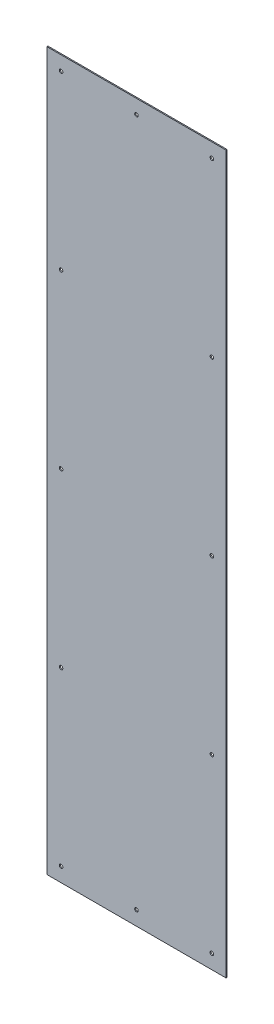
ISO-10303-21;
HEADER;
FILE_DESCRIPTION(('STEP AP214'),'2;1');
FILE_NAME('part.step','',(''),(''),'','','');
FILE_SCHEMA(('AUTOMOTIVE_DESIGN { 1 0 10303 214 1 1 1 1 }'));
ENDSEC;
DATA;
#1=APPLICATION_CONTEXT('core data for automotive mechanical design processes');
#2=APPLICATION_PROTOCOL_DEFINITION('international standard','automotive_design',2000,#1);
#3=PRODUCT_CONTEXT('',#1,'mechanical');
#4=PRODUCT('Part','Part','',(#3));
#5=PRODUCT_RELATED_PRODUCT_CATEGORY('part','',(#4));
#6=PRODUCT_DEFINITION_FORMATION('','',#4);
#7=PRODUCT_DEFINITION_CONTEXT('part definition',#1,'design');
#8=PRODUCT_DEFINITION('design','',#6,#7);
#9=PRODUCT_DEFINITION_SHAPE('','',#8);
#10=(LENGTH_UNIT() NAMED_UNIT(*) SI_UNIT(.MILLI.,.METRE.));
#11=(NAMED_UNIT(*) PLANE_ANGLE_UNIT() SI_UNIT($,.RADIAN.));
#12=(NAMED_UNIT(*) SI_UNIT($,.STERADIAN.) SOLID_ANGLE_UNIT());
#13=UNCERTAINTY_MEASURE_WITH_UNIT(LENGTH_MEASURE(1.E-05),#10,'distance_accuracy_value','');
#14=(GEOMETRIC_REPRESENTATION_CONTEXT(3) GLOBAL_UNCERTAINTY_ASSIGNED_CONTEXT((#13)) GLOBAL_UNIT_ASSIGNED_CONTEXT((#10,
#11,#12)) REPRESENTATION_CONTEXT('',''));
#15=CARTESIAN_POINT('',(0.,0.,0.));
#16=DIRECTION('',(0.,0.,1.));
#17=DIRECTION('',(1.,0.,0.));
#18=AXIS2_PLACEMENT_3D('',#15,#16,#17);
#19=CARTESIAN_POINT('',(160.,640.,1.9));
#20=DIRECTION('',(-1.,0.,0.));
#21=DIRECTION('',(0.,-1.,0.));
#22=AXIS2_PLACEMENT_3D('',#19,#20,#21);
#23=PLANE('',#22);
#24=DIRECTION('',(0.,1.,0.));
#25=VECTOR('',#24,1.);
#26=CARTESIAN_POINT('',(160.,640.,0.));
#27=LINE('',#26,#25);
#28=CARTESIAN_POINT('',(160.,-640.,0.));
#29=VERTEX_POINT('',#28);
#30=CARTESIAN_POINT('',(160.,640.,0.));
#31=VERTEX_POINT('',#30);
#32=EDGE_CURVE('E98',#29,#31,#27,.T.);
#33=ORIENTED_EDGE('',*,*,#32,.T.);
#34=DIRECTION('',(0.,0.,-1.));
#35=VECTOR('',#34,1.);
#36=CARTESIAN_POINT('',(160.,640.,1.9));
#37=LINE('',#36,#35);
#38=CARTESIAN_POINT('',(160.,640.,1.9));
#39=VERTEX_POINT('',#38);
#40=EDGE_CURVE('E11',#39,#31,#37,.T.);
#41=ORIENTED_EDGE('',*,*,#40,.F.);
#42=DIRECTION('',(0.,1.,0.));
#43=VECTOR('',#42,1.);
#44=CARTESIAN_POINT('',(160.,640.,1.9));
#45=LINE('',#44,#43);
#46=CARTESIAN_POINT('',(160.,-640.,1.9));
#47=VERTEX_POINT('',#46);
#48=EDGE_CURVE('E85',#47,#39,#45,.T.);
#49=ORIENTED_EDGE('',*,*,#48,.F.);
#50=DIRECTION('',(0.,0.,-1.));
#51=VECTOR('',#50,1.);
#52=CARTESIAN_POINT('',(160.,-640.,1.9));
#53=LINE('',#52,#51);
#54=EDGE_CURVE('E94',#47,#29,#53,.T.);
#55=ORIENTED_EDGE('',*,*,#54,.T.);
#56=EDGE_LOOP('',(#33,#41,#49,#55));
#57=FACE_BOUND('',#56,.T.);
#58=ADVANCED_FACE('F32',(#57),#23,.F.);
#59=CARTESIAN_POINT('',(-160.,640.,1.9));
#60=DIRECTION('',(0.,-1.,0.));
#61=DIRECTION('',(0.,0.,-1.));
#62=AXIS2_PLACEMENT_3D('',#59,#60,#61);
#63=PLANE('',#62);
#64=DIRECTION('',(-1.,0.,0.));
#65=VECTOR('',#64,1.);
#66=CARTESIAN_POINT('',(-160.,640.,0.));
#67=LINE('',#66,#65);
#68=CARTESIAN_POINT('',(-160.,640.,0.));
#69=VERTEX_POINT('',#68);
#70=EDGE_CURVE('E89',#31,#69,#67,.T.);
#71=ORIENTED_EDGE('',*,*,#70,.T.);
#72=DIRECTION('',(0.,0.,-1.));
#73=VECTOR('',#72,1.);
#74=CARTESIAN_POINT('',(-160.,640.,1.9));
#75=LINE('',#74,#73);
#76=CARTESIAN_POINT('',(-160.,640.,1.9));
#77=VERTEX_POINT('',#76);
#78=EDGE_CURVE('E41',#77,#69,#75,.T.);
#79=ORIENTED_EDGE('',*,*,#78,.F.);
#80=DIRECTION('',(-1.,0.,0.));
#81=VECTOR('',#80,1.);
#82=CARTESIAN_POINT('',(-160.,640.,1.9));
#83=LINE('',#82,#81);
#84=EDGE_CURVE('E80',#39,#77,#83,.T.);
#85=ORIENTED_EDGE('',*,*,#84,.F.);
#86=ORIENTED_EDGE('',*,*,#40,.T.);
#87=EDGE_LOOP('',(#71,#79,#85,#86));
#88=FACE_BOUND('',#87,.T.);
#89=ADVANCED_FACE('F88',(#88),#63,.F.);
#90=CARTESIAN_POINT('',(-160.,640.,1.9));
#91=DIRECTION('',(1.,0.,0.));
#92=DIRECTION('',(0.,1.,0.));
#93=AXIS2_PLACEMENT_3D('',#90,#91,#92);
#94=PLANE('',#93);
#95=DIRECTION('',(0.,-1.,0.));
#96=VECTOR('',#95,1.);
#97=CARTESIAN_POINT('',(-160.,640.,0.));
#98=LINE('',#97,#96);
#99=CARTESIAN_POINT('',(-160.,-640.,0.));
#100=VERTEX_POINT('',#99);
#101=EDGE_CURVE('E67',#69,#100,#98,.T.);
#102=ORIENTED_EDGE('',*,*,#101,.T.);
#103=DIRECTION('',(0.,0.,-1.));
#104=VECTOR('',#103,1.);
#105=CARTESIAN_POINT('',(-160.,-640.,1.9));
#106=LINE('',#105,#104);
#107=CARTESIAN_POINT('',(-160.,-640.,1.9));
#108=VERTEX_POINT('',#107);
#109=EDGE_CURVE('E90',#108,#100,#106,.T.);
#110=ORIENTED_EDGE('',*,*,#109,.F.);
#111=DIRECTION('',(0.,-1.,0.));
#112=VECTOR('',#111,1.);
#113=CARTESIAN_POINT('',(-160.,640.,1.9));
#114=LINE('',#113,#112);
#115=EDGE_CURVE('E83',#77,#108,#114,.T.);
#116=ORIENTED_EDGE('',*,*,#115,.F.);
#117=ORIENTED_EDGE('',*,*,#78,.T.);
#118=EDGE_LOOP('',(#102,#110,#116,#117));
#119=FACE_BOUND('',#118,.T.);
#120=ADVANCED_FACE('F92',(#119),#94,.F.);
#121=CARTESIAN_POINT('',(-160.,-640.,1.9));
#122=DIRECTION('',(0.,1.,0.));
#123=DIRECTION('',(0.,0.,1.));
#124=AXIS2_PLACEMENT_3D('',#121,#122,#123);
#125=PLANE('',#124);
#126=DIRECTION('',(1.,0.,0.));
#127=VECTOR('',#126,1.);
#128=CARTESIAN_POINT('',(-160.,-640.,0.));
#129=LINE('',#128,#127);
#130=EDGE_CURVE('E73',#100,#29,#129,.T.);
#131=ORIENTED_EDGE('',*,*,#130,.T.);
#132=ORIENTED_EDGE('',*,*,#54,.F.);
#133=DIRECTION('',(1.,0.,0.));
#134=VECTOR('',#133,1.);
#135=CARTESIAN_POINT('',(-160.,-640.,1.9));
#136=LINE('',#135,#134);
#137=EDGE_CURVE('E50',#108,#47,#136,.T.);
#138=ORIENTED_EDGE('',*,*,#137,.F.);
#139=ORIENTED_EDGE('',*,*,#109,.T.);
#140=EDGE_LOOP('',(#131,#132,#138,#139));
#141=FACE_BOUND('',#140,.T.);
#142=ADVANCED_FACE('F188',(#141),#125,.F.);
#143=CARTESIAN_POINT('',(0.,0.,1.9));
#144=DIRECTION('',(0.,0.,1.));
#145=DIRECTION('',(1.,0.,0.));
#146=AXIS2_PLACEMENT_3D('',#143,#144,#145);
#147=PLANE('',#146);
#148=CARTESIAN_POINT('',(-134.6,-307.3,1.9));
#149=DIRECTION('',(0.,0.,1.));
#150=DIRECTION('',(1.,0.,0.));
#151=AXIS2_PLACEMENT_3D('',#148,#149,#150);
#152=CIRCLE('',#151,3.175);
#153=CARTESIAN_POINT('',(-131.425,-307.3,1.9));
#154=VERTEX_POINT('',#153);
#155=EDGE_CURVE('E167',#154,#154,#152,.T.);
#156=ORIENTED_EDGE('',*,*,#155,.F.);
#157=EDGE_LOOP('',(#156));
#158=FACE_BOUND('',#157,.T.);
#159=CARTESIAN_POINT('',(134.6,0.,1.9));
#160=DIRECTION('',(0.,0.,1.));
#161=DIRECTION('',(1.,0.,0.));
#162=AXIS2_PLACEMENT_3D('',#159,#160,#161);
#163=CIRCLE('',#162,3.175);
#164=CARTESIAN_POINT('',(137.775,0.,1.9));
#165=VERTEX_POINT('',#164);
#166=EDGE_CURVE('E166',#165,#165,#163,.T.);
#167=ORIENTED_EDGE('',*,*,#166,.F.);
#168=EDGE_LOOP('',(#167));
#169=FACE_BOUND('',#168,.T.);
#170=CARTESIAN_POINT('',(-134.6,0.,1.9));
#171=DIRECTION('',(0.,0.,1.));
#172=DIRECTION('',(1.,0.,0.));
#173=AXIS2_PLACEMENT_3D('',#170,#171,#172);
#174=CIRCLE('',#173,3.175);
#175=CARTESIAN_POINT('',(-131.425,0.,1.9));
#176=VERTEX_POINT('',#175);
#177=EDGE_CURVE('E153',#176,#176,#174,.T.);
#178=ORIENTED_EDGE('',*,*,#177,.F.);
#179=EDGE_LOOP('',(#178));
#180=FACE_BOUND('',#179,.T.);
#181=CARTESIAN_POINT('',(134.6,-307.3,1.9));
#182=DIRECTION('',(0.,0.,1.));
#183=DIRECTION('',(1.,0.,0.));
#184=AXIS2_PLACEMENT_3D('',#181,#182,#183);
#185=CIRCLE('',#184,3.175);
#186=CARTESIAN_POINT('',(137.775,-307.3,1.9));
#187=VERTEX_POINT('',#186);
#188=EDGE_CURVE('E170',#187,#187,#185,.T.);
#189=ORIENTED_EDGE('',*,*,#188,.F.);
#190=EDGE_LOOP('',(#189));
#191=FACE_BOUND('',#190,.T.);
#192=CARTESIAN_POINT('',(-134.6,307.3,1.9));
#193=DIRECTION('',(0.,0.,1.));
#194=DIRECTION('',(-1.,0.,0.));
#195=AXIS2_PLACEMENT_3D('',#192,#193,#194);
#196=CIRCLE('',#195,3.175);
#197=CARTESIAN_POINT('',(-137.775,307.3,1.9));
#198=VERTEX_POINT('',#197);
#199=EDGE_CURVE('E176',#198,#198,#196,.T.);
#200=ORIENTED_EDGE('',*,*,#199,.F.);
#201=EDGE_LOOP('',(#200));
#202=FACE_BOUND('',#201,.T.);
#203=CARTESIAN_POINT('',(134.6,307.3,1.9));
#204=DIRECTION('',(0.,0.,1.));
#205=DIRECTION('',(-1.,0.,0.));
#206=AXIS2_PLACEMENT_3D('',#203,#204,#205);
#207=CIRCLE('',#206,3.175);
#208=CARTESIAN_POINT('',(131.425,307.3,1.9));
#209=VERTEX_POINT('',#208);
#210=EDGE_CURVE('E173',#209,#209,#207,.T.);
#211=ORIENTED_EDGE('',*,*,#210,.F.);
#212=EDGE_LOOP('',(#211));
#213=FACE_BOUND('',#212,.T.);
#214=CARTESIAN_POINT('',(0.,614.6,1.9));
#215=DIRECTION('',(0.,0.,1.));
#216=DIRECTION('',(1.,0.,0.));
#217=AXIS2_PLACEMENT_3D('',#214,#215,#216);
#218=CIRCLE('',#217,3.175);
#219=CARTESIAN_POINT('',(3.17499999999997,614.6,1.9));
#220=VERTEX_POINT('',#219);
#221=EDGE_CURVE('E149',#220,#220,#218,.T.);
#222=ORIENTED_EDGE('',*,*,#221,.F.);
#223=EDGE_LOOP('',(#222));
#224=FACE_BOUND('',#223,.T.);
#225=CARTESIAN_POINT('',(0.,-614.6,1.9));
#226=DIRECTION('',(0.,0.,1.));
#227=DIRECTION('',(-1.,0.,0.));
#228=AXIS2_PLACEMENT_3D('',#225,#226,#227);
#229=CIRCLE('',#228,3.175);
#230=CARTESIAN_POINT('',(-3.17500000000003,-614.6,1.9));
#231=VERTEX_POINT('',#230);
#232=EDGE_CURVE('E152',#231,#231,#229,.T.);
#233=ORIENTED_EDGE('',*,*,#232,.F.);
#234=EDGE_LOOP('',(#233));
#235=FACE_BOUND('',#234,.T.);
#236=CARTESIAN_POINT('',(-134.6,-614.6,1.9));
#237=DIRECTION('',(0.,0.,1.));
#238=DIRECTION('',(-1.,0.,0.));
#239=AXIS2_PLACEMENT_3D('',#236,#237,#238);
#240=CIRCLE('',#239,3.175);
#241=CARTESIAN_POINT('',(-137.775,-614.6,1.9));
#242=VERTEX_POINT('',#241);
#243=EDGE_CURVE('E156',#242,#242,#240,.T.);
#244=ORIENTED_EDGE('',*,*,#243,.F.);
#245=EDGE_LOOP('',(#244));
#246=FACE_BOUND('',#245,.T.);
#247=CARTESIAN_POINT('',(134.6,-614.6,1.9));
#248=DIRECTION('',(0.,0.,1.));
#249=DIRECTION('',(1.,0.,0.));
#250=AXIS2_PLACEMENT_3D('',#247,#248,#249);
#251=CIRCLE('',#250,3.17499999999981);
#252=CARTESIAN_POINT('',(137.775,-614.6,1.9));
#253=VERTEX_POINT('',#252);
#254=EDGE_CURVE('E159',#253,#253,#251,.T.);
#255=ORIENTED_EDGE('',*,*,#254,.F.);
#256=EDGE_LOOP('',(#255));
#257=FACE_BOUND('',#256,.T.);
#258=CARTESIAN_POINT('',(134.6,614.6,1.9));
#259=DIRECTION('',(0.,0.,1.));
#260=DIRECTION('',(-1.,0.,0.));
#261=AXIS2_PLACEMENT_3D('',#258,#259,#260);
#262=CIRCLE('',#261,3.17499999999981);
#263=CARTESIAN_POINT('',(131.425,614.6,1.9));
#264=VERTEX_POINT('',#263);
#265=EDGE_CURVE('E114',#264,#264,#262,.T.);
#266=ORIENTED_EDGE('',*,*,#265,.F.);
#267=EDGE_LOOP('',(#266));
#268=FACE_BOUND('',#267,.T.);
#269=CARTESIAN_POINT('',(-134.6,614.6,1.9));
#270=DIRECTION('',(0.,0.,1.));
#271=DIRECTION('',(1.,0.,0.));
#272=AXIS2_PLACEMENT_3D('',#269,#270,#271);
#273=CIRCLE('',#272,3.175);
#274=CARTESIAN_POINT('',(-131.425,614.6,1.9));
#275=VERTEX_POINT('',#274);
#276=EDGE_CURVE('E109',#275,#275,#273,.T.);
#277=ORIENTED_EDGE('',*,*,#276,.F.);
#278=EDGE_LOOP('',(#277));
#279=FACE_BOUND('',#278,.T.);
#280=ORIENTED_EDGE('',*,*,#48,.T.);
#281=ORIENTED_EDGE('',*,*,#84,.T.);
#282=ORIENTED_EDGE('',*,*,#115,.T.);
#283=ORIENTED_EDGE('',*,*,#137,.T.);
#284=EDGE_LOOP('',(#280,#281,#282,#283));
#285=FACE_BOUND('',#284,.T.);
#286=ADVANCED_FACE('F81',(#158,#169,#180,#191,#202,#213,#224,#235,#246,#257,#268,#279,#285),
#147,.T.);
#287=CARTESIAN_POINT('',(0.,0.,0.));
#288=DIRECTION('',(0.,0.,1.));
#289=DIRECTION('',(1.,0.,0.));
#290=AXIS2_PLACEMENT_3D('',#287,#288,#289);
#291=PLANE('',#290);
#292=CARTESIAN_POINT('',(-134.6,-307.3,0.));
#293=DIRECTION('',(0.,0.,1.));
#294=DIRECTION('',(1.,0.,0.));
#295=AXIS2_PLACEMENT_3D('',#292,#293,#294);
#296=CIRCLE('',#295,3.175);
#297=CARTESIAN_POINT('',(-131.425,-307.3,0.));
#298=VERTEX_POINT('',#297);
#299=EDGE_CURVE('E35',#298,#298,#296,.T.);
#300=ORIENTED_EDGE('',*,*,#299,.T.);
#301=EDGE_LOOP('',(#300));
#302=FACE_BOUND('',#301,.T.);
#303=CARTESIAN_POINT('',(134.6,0.,0.));
#304=DIRECTION('',(0.,0.,1.));
#305=DIRECTION('',(1.,0.,0.));
#306=AXIS2_PLACEMENT_3D('',#303,#304,#305);
#307=CIRCLE('',#306,3.175);
#308=CARTESIAN_POINT('',(137.775,0.,0.));
#309=VERTEX_POINT('',#308);
#310=EDGE_CURVE('E137',#309,#309,#307,.T.);
#311=ORIENTED_EDGE('',*,*,#310,.T.);
#312=EDGE_LOOP('',(#311));
#313=FACE_BOUND('',#312,.T.);
#314=CARTESIAN_POINT('',(-134.6,0.,0.));
#315=DIRECTION('',(0.,0.,1.));
#316=DIRECTION('',(1.,0.,0.));
#317=AXIS2_PLACEMENT_3D('',#314,#315,#316);
#318=CIRCLE('',#317,3.175);
#319=CARTESIAN_POINT('',(-131.425,0.,0.));
#320=VERTEX_POINT('',#319);
#321=EDGE_CURVE('E135',#320,#320,#318,.T.);
#322=ORIENTED_EDGE('',*,*,#321,.T.);
#323=EDGE_LOOP('',(#322));
#324=FACE_BOUND('',#323,.T.);
#325=CARTESIAN_POINT('',(134.6,-307.3,0.));
#326=DIRECTION('',(0.,0.,1.));
#327=DIRECTION('',(1.,0.,0.));
#328=AXIS2_PLACEMENT_3D('',#325,#326,#327);
#329=CIRCLE('',#328,3.175);
#330=CARTESIAN_POINT('',(137.775,-307.3,0.));
#331=VERTEX_POINT('',#330);
#332=EDGE_CURVE('E132',#331,#331,#329,.T.);
#333=ORIENTED_EDGE('',*,*,#332,.T.);
#334=EDGE_LOOP('',(#333));
#335=FACE_BOUND('',#334,.T.);
#336=CARTESIAN_POINT('',(-134.6,307.3,0.));
#337=DIRECTION('',(0.,0.,1.));
#338=DIRECTION('',(1.,0.,0.));
#339=AXIS2_PLACEMENT_3D('',#336,#337,#338);
#340=CIRCLE('',#339,3.175);
#341=CARTESIAN_POINT('',(-131.425,307.3,0.));
#342=VERTEX_POINT('',#341);
#343=EDGE_CURVE('E129',#342,#342,#340,.T.);
#344=ORIENTED_EDGE('',*,*,#343,.T.);
#345=EDGE_LOOP('',(#344));
#346=FACE_BOUND('',#345,.T.);
#347=CARTESIAN_POINT('',(134.6,307.3,0.));
#348=DIRECTION('',(0.,0.,1.));
#349=DIRECTION('',(1.,0.,0.));
#350=AXIS2_PLACEMENT_3D('',#347,#348,#349);
#351=CIRCLE('',#350,3.175);
#352=CARTESIAN_POINT('',(137.775,307.3,0.));
#353=VERTEX_POINT('',#352);
#354=EDGE_CURVE('E126',#353,#353,#351,.T.);
#355=ORIENTED_EDGE('',*,*,#354,.T.);
#356=EDGE_LOOP('',(#355));
#357=FACE_BOUND('',#356,.T.);
#358=CARTESIAN_POINT('',(0.,614.6,0.));
#359=DIRECTION('',(0.,0.,1.));
#360=DIRECTION('',(1.,0.,0.));
#361=AXIS2_PLACEMENT_3D('',#358,#359,#360);
#362=CIRCLE('',#361,3.175);
#363=CARTESIAN_POINT('',(3.17499999999997,614.6,0.));
#364=VERTEX_POINT('',#363);
#365=EDGE_CURVE('E123',#364,#364,#362,.T.);
#366=ORIENTED_EDGE('',*,*,#365,.T.);
#367=EDGE_LOOP('',(#366));
#368=FACE_BOUND('',#367,.T.);
#369=CARTESIAN_POINT('',(0.,-614.6,0.));
#370=DIRECTION('',(0.,0.,1.));
#371=DIRECTION('',(1.,0.,0.));
#372=AXIS2_PLACEMENT_3D('',#369,#370,#371);
#373=CIRCLE('',#372,3.175);
#374=CARTESIAN_POINT('',(3.17499999999997,-614.6,0.));
#375=VERTEX_POINT('',#374);
#376=EDGE_CURVE('E120',#375,#375,#373,.T.);
#377=ORIENTED_EDGE('',*,*,#376,.T.);
#378=EDGE_LOOP('',(#377));
#379=FACE_BOUND('',#378,.T.);
#380=CARTESIAN_POINT('',(-134.6,-614.6,0.));
#381=DIRECTION('',(0.,0.,1.));
#382=DIRECTION('',(1.,0.,0.));
#383=AXIS2_PLACEMENT_3D('',#380,#381,#382);
#384=CIRCLE('',#383,3.175);
#385=CARTESIAN_POINT('',(-131.425,-614.6,0.));
#386=VERTEX_POINT('',#385);
#387=EDGE_CURVE('E117',#386,#386,#384,.T.);
#388=ORIENTED_EDGE('',*,*,#387,.T.);
#389=EDGE_LOOP('',(#388));
#390=FACE_BOUND('',#389,.T.);
#391=CARTESIAN_POINT('',(134.6,-614.6,0.));
#392=DIRECTION('',(0.,0.,1.));
#393=DIRECTION('',(1.,0.,0.));
#394=AXIS2_PLACEMENT_3D('',#391,#392,#393);
#395=CIRCLE('',#394,3.17499999999981);
#396=CARTESIAN_POINT('',(137.775,-614.6,0.));
#397=VERTEX_POINT('',#396);
#398=EDGE_CURVE('E113',#397,#397,#395,.T.);
#399=ORIENTED_EDGE('',*,*,#398,.T.);
#400=EDGE_LOOP('',(#399));
#401=FACE_BOUND('',#400,.T.);
#402=CARTESIAN_POINT('',(134.6,614.6,0.));
#403=DIRECTION('',(0.,0.,1.));
#404=DIRECTION('',(1.,0.,0.));
#405=AXIS2_PLACEMENT_3D('',#402,#403,#404);
#406=CIRCLE('',#405,3.17499999999981);
#407=CARTESIAN_POINT('',(137.775,614.6,0.));
#408=VERTEX_POINT('',#407);
#409=EDGE_CURVE('E110',#408,#408,#406,.T.);
#410=ORIENTED_EDGE('',*,*,#409,.T.);
#411=EDGE_LOOP('',(#410));
#412=FACE_BOUND('',#411,.T.);
#413=CARTESIAN_POINT('',(-134.6,614.6,0.));
#414=DIRECTION('',(0.,0.,1.));
#415=DIRECTION('',(1.,0.,0.));
#416=AXIS2_PLACEMENT_3D('',#413,#414,#415);
#417=CIRCLE('',#416,3.175);
#418=CARTESIAN_POINT('',(-131.425,614.6,0.));
#419=VERTEX_POINT('',#418);
#420=EDGE_CURVE('E101',#419,#419,#417,.T.);
#421=ORIENTED_EDGE('',*,*,#420,.T.);
#422=EDGE_LOOP('',(#421));
#423=FACE_BOUND('',#422,.T.);
#424=ORIENTED_EDGE('',*,*,#32,.F.);
#425=ORIENTED_EDGE('',*,*,#130,.F.);
#426=ORIENTED_EDGE('',*,*,#101,.F.);
#427=ORIENTED_EDGE('',*,*,#70,.F.);
#428=EDGE_LOOP('',(#424,#425,#426,#427));
#429=FACE_BOUND('',#428,.T.);
#430=ADVANCED_FACE('F187',(#302,#313,#324,#335,#346,#357,#368,#379,#390,#401,#412,#423,#429),
#291,.F.);
#431=CARTESIAN_POINT('',(-134.6,614.6,-8.1));
#432=DIRECTION('',(0.,0.,1.));
#433=DIRECTION('',(1.,0.,0.));
#434=AXIS2_PLACEMENT_3D('',#431,#432,#433);
#435=CYLINDRICAL_SURFACE('',#434,3.175);
#436=ORIENTED_EDGE('',*,*,#276,.T.);
#437=EDGE_LOOP('',(#436));
#438=FACE_BOUND('',#437,.T.);
#439=ORIENTED_EDGE('',*,*,#420,.F.);
#440=EDGE_LOOP('',(#439));
#441=FACE_BOUND('',#440,.T.);
#442=ADVANCED_FACE('F210',(#438,#441),#435,.F.);
#443=CARTESIAN_POINT('',(134.6,614.6,-8.1));
#444=DIRECTION('',(0.,0.,1.));
#445=DIRECTION('',(1.,0.,0.));
#446=AXIS2_PLACEMENT_3D('',#443,#444,#445);
#447=CYLINDRICAL_SURFACE('',#446,3.17499999999981);
#448=ORIENTED_EDGE('',*,*,#265,.T.);
#449=EDGE_LOOP('',(#448));
#450=FACE_BOUND('',#449,.T.);
#451=ORIENTED_EDGE('',*,*,#409,.F.);
#452=EDGE_LOOP('',(#451));
#453=FACE_BOUND('',#452,.T.);
#454=ADVANCED_FACE('F206',(#450,#453),#447,.F.);
#455=CARTESIAN_POINT('',(134.6,-614.6,-8.1));
#456=DIRECTION('',(0.,0.,1.));
#457=DIRECTION('',(1.,0.,0.));
#458=AXIS2_PLACEMENT_3D('',#455,#456,#457);
#459=CYLINDRICAL_SURFACE('',#458,3.17499999999981);
#460=ORIENTED_EDGE('',*,*,#254,.T.);
#461=EDGE_LOOP('',(#460));
#462=FACE_BOUND('',#461,.T.);
#463=ORIENTED_EDGE('',*,*,#398,.F.);
#464=EDGE_LOOP('',(#463));
#465=FACE_BOUND('',#464,.T.);
#466=ADVANCED_FACE('F209',(#462,#465),#459,.F.);
#467=CARTESIAN_POINT('',(-134.6,-614.6,-8.1));
#468=DIRECTION('',(0.,0.,1.));
#469=DIRECTION('',(1.,0.,0.));
#470=AXIS2_PLACEMENT_3D('',#467,#468,#469);
#471=CYLINDRICAL_SURFACE('',#470,3.175);
#472=ORIENTED_EDGE('',*,*,#243,.T.);
#473=EDGE_LOOP('',(#472));
#474=FACE_BOUND('',#473,.T.);
#475=ORIENTED_EDGE('',*,*,#387,.F.);
#476=EDGE_LOOP('',(#475));
#477=FACE_BOUND('',#476,.T.);
#478=ADVANCED_FACE('F276',(#474,#477),#471,.F.);
#479=CARTESIAN_POINT('',(0.,-614.6,-8.1));
#480=DIRECTION('',(0.,0.,1.));
#481=DIRECTION('',(1.,0.,0.));
#482=AXIS2_PLACEMENT_3D('',#479,#480,#481);
#483=CYLINDRICAL_SURFACE('',#482,3.175);
#484=ORIENTED_EDGE('',*,*,#232,.T.);
#485=EDGE_LOOP('',(#484));
#486=FACE_BOUND('',#485,.T.);
#487=ORIENTED_EDGE('',*,*,#376,.F.);
#488=EDGE_LOOP('',(#487));
#489=FACE_BOUND('',#488,.T.);
#490=ADVANCED_FACE('F286',(#486,#489),#483,.F.);
#491=CARTESIAN_POINT('',(0.,614.6,-8.1));
#492=DIRECTION('',(0.,0.,1.));
#493=DIRECTION('',(1.,0.,0.));
#494=AXIS2_PLACEMENT_3D('',#491,#492,#493);
#495=CYLINDRICAL_SURFACE('',#494,3.175);
#496=ORIENTED_EDGE('',*,*,#221,.T.);
#497=EDGE_LOOP('',(#496));
#498=FACE_BOUND('',#497,.T.);
#499=ORIENTED_EDGE('',*,*,#365,.F.);
#500=EDGE_LOOP('',(#499));
#501=FACE_BOUND('',#500,.T.);
#502=ADVANCED_FACE('F296',(#498,#501),#495,.F.);
#503=CARTESIAN_POINT('',(134.6,307.3,-8.1));
#504=DIRECTION('',(0.,0.,1.));
#505=DIRECTION('',(1.,0.,0.));
#506=AXIS2_PLACEMENT_3D('',#503,#504,#505);
#507=CYLINDRICAL_SURFACE('',#506,3.175);
#508=ORIENTED_EDGE('',*,*,#210,.T.);
#509=EDGE_LOOP('',(#508));
#510=FACE_BOUND('',#509,.T.);
#511=ORIENTED_EDGE('',*,*,#354,.F.);
#512=EDGE_LOOP('',(#511));
#513=FACE_BOUND('',#512,.T.);
#514=ADVANCED_FACE('F306',(#510,#513),#507,.F.);
#515=CARTESIAN_POINT('',(-134.6,307.3,-8.1));
#516=DIRECTION('',(0.,0.,1.));
#517=DIRECTION('',(1.,0.,0.));
#518=AXIS2_PLACEMENT_3D('',#515,#516,#517);
#519=CYLINDRICAL_SURFACE('',#518,3.175);
#520=ORIENTED_EDGE('',*,*,#199,.T.);
#521=EDGE_LOOP('',(#520));
#522=FACE_BOUND('',#521,.T.);
#523=ORIENTED_EDGE('',*,*,#343,.F.);
#524=EDGE_LOOP('',(#523));
#525=FACE_BOUND('',#524,.T.);
#526=ADVANCED_FACE('F316',(#522,#525),#519,.F.);
#527=CARTESIAN_POINT('',(134.6,-307.3,-8.1));
#528=DIRECTION('',(0.,0.,1.));
#529=DIRECTION('',(1.,0.,0.));
#530=AXIS2_PLACEMENT_3D('',#527,#528,#529);
#531=CYLINDRICAL_SURFACE('',#530,3.175);
#532=ORIENTED_EDGE('',*,*,#188,.T.);
#533=EDGE_LOOP('',(#532));
#534=FACE_BOUND('',#533,.T.);
#535=ORIENTED_EDGE('',*,*,#332,.F.);
#536=EDGE_LOOP('',(#535));
#537=FACE_BOUND('',#536,.T.);
#538=ADVANCED_FACE('F182',(#534,#537),#531,.F.);
#539=CARTESIAN_POINT('',(-134.6,0.,-8.1));
#540=DIRECTION('',(0.,0.,1.));
#541=DIRECTION('',(1.,0.,0.));
#542=AXIS2_PLACEMENT_3D('',#539,#540,#541);
#543=CYLINDRICAL_SURFACE('',#542,3.175);
#544=ORIENTED_EDGE('',*,*,#177,.T.);
#545=EDGE_LOOP('',(#544));
#546=FACE_BOUND('',#545,.T.);
#547=ORIENTED_EDGE('',*,*,#321,.F.);
#548=EDGE_LOOP('',(#547));
#549=FACE_BOUND('',#548,.T.);
#550=ADVANCED_FACE('F335',(#546,#549),#543,.F.);
#551=CARTESIAN_POINT('',(134.6,0.,-8.1));
#552=DIRECTION('',(0.,0.,1.));
#553=DIRECTION('',(1.,0.,0.));
#554=AXIS2_PLACEMENT_3D('',#551,#552,#553);
#555=CYLINDRICAL_SURFACE('',#554,3.175);
#556=ORIENTED_EDGE('',*,*,#166,.T.);
#557=EDGE_LOOP('',(#556));
#558=FACE_BOUND('',#557,.T.);
#559=ORIENTED_EDGE('',*,*,#310,.F.);
#560=EDGE_LOOP('',(#559));
#561=FACE_BOUND('',#560,.T.);
#562=ADVANCED_FACE('F344',(#558,#561),#555,.F.);
#563=CARTESIAN_POINT('',(-134.6,-307.3,-8.1));
#564=DIRECTION('',(0.,0.,1.));
#565=DIRECTION('',(1.,0.,0.));
#566=AXIS2_PLACEMENT_3D('',#563,#564,#565);
#567=CYLINDRICAL_SURFACE('',#566,3.175);
#568=ORIENTED_EDGE('',*,*,#155,.T.);
#569=EDGE_LOOP('',(#568));
#570=FACE_BOUND('',#569,.T.);
#571=ORIENTED_EDGE('',*,*,#299,.F.);
#572=EDGE_LOOP('',(#571));
#573=FACE_BOUND('',#572,.T.);
#574=ADVANCED_FACE('F354',(#570,#573),#567,.F.);
#575=CLOSED_SHELL('',(#58,#89,#120,#142,#286,#430,#442,#454,#466,#478,#490,#502,#514,#526,#538,
#550,#562,#574));
#576=MANIFOLD_SOLID_BREP('B2',#575);
#577=ADVANCED_BREP_SHAPE_REPRESENTATION('',(#18,#576),#14);
#578=SHAPE_DEFINITION_REPRESENTATION(#9,#577);
ENDSEC;
END-ISO-10303-21;
